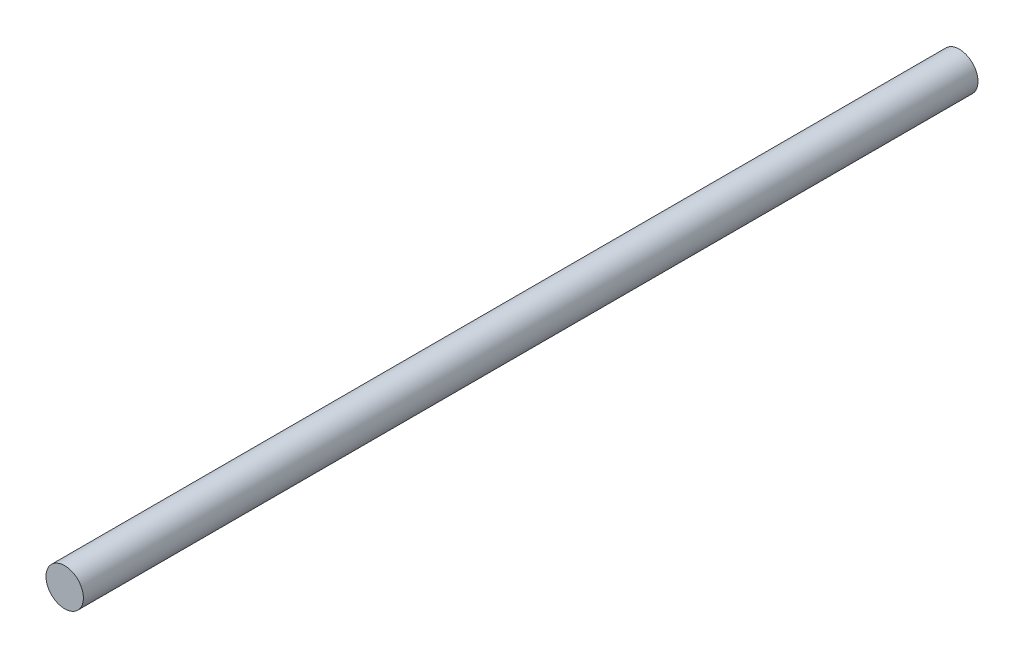
ISO-10303-21;
HEADER;
FILE_DESCRIPTION(('STEP AP214'),'2;1');
FILE_NAME('part.step','',(''),(''),'','','');
FILE_SCHEMA(('AUTOMOTIVE_DESIGN { 1 0 10303 214 1 1 1 1 }'));
ENDSEC;
DATA;
#1=APPLICATION_CONTEXT('core data for automotive mechanical design processes');
#2=APPLICATION_PROTOCOL_DEFINITION('international standard','automotive_design',2000,#1);
#3=PRODUCT_CONTEXT('',#1,'mechanical');
#4=PRODUCT('Part','Part','',(#3));
#5=PRODUCT_RELATED_PRODUCT_CATEGORY('part','',(#4));
#6=PRODUCT_DEFINITION_FORMATION('','',#4);
#7=PRODUCT_DEFINITION_CONTEXT('part definition',#1,'design');
#8=PRODUCT_DEFINITION('design','',#6,#7);
#9=PRODUCT_DEFINITION_SHAPE('','',#8);
#10=(LENGTH_UNIT() NAMED_UNIT(*) SI_UNIT(.MILLI.,.METRE.));
#11=(NAMED_UNIT(*) PLANE_ANGLE_UNIT() SI_UNIT($,.RADIAN.));
#12=(NAMED_UNIT(*) SI_UNIT($,.STERADIAN.) SOLID_ANGLE_UNIT());
#13=UNCERTAINTY_MEASURE_WITH_UNIT(LENGTH_MEASURE(1.E-05),#10,'distance_accuracy_value','');
#14=(GEOMETRIC_REPRESENTATION_CONTEXT(3) GLOBAL_UNCERTAINTY_ASSIGNED_CONTEXT((#13)) GLOBAL_UNIT_ASSIGNED_CONTEXT((#10,
#11,#12)) REPRESENTATION_CONTEXT('',''));
#15=CARTESIAN_POINT('',(0.,0.,0.));
#16=DIRECTION('',(0.,0.,1.));
#17=DIRECTION('',(1.,0.,0.));
#18=AXIS2_PLACEMENT_3D('',#15,#16,#17);
#19=CARTESIAN_POINT('',(0.,0.,-303.53));
#20=DIRECTION('',(0.,0.,1.));
#21=DIRECTION('',(1.,0.,0.));
#22=AXIS2_PLACEMENT_3D('',#19,#20,#21);
#23=CYLINDRICAL_SURFACE('',#22,6.35);
#24=CARTESIAN_POINT('',(0.,0.,-303.53));
#25=DIRECTION('',(0.,0.,1.));
#26=DIRECTION('',(1.,0.,0.));
#27=AXIS2_PLACEMENT_3D('',#24,#25,#26);
#28=CIRCLE('',#27,6.35);
#29=CARTESIAN_POINT('',(6.35,0.,-303.53));
#30=VERTEX_POINT('',#29);
#31=EDGE_CURVE('E10',#30,#30,#28,.T.);
#32=CARTESIAN_POINT('',(0.,0.,0.));
#33=DIRECTION('',(0.,0.,1.));
#34=DIRECTION('',(1.,0.,0.));
#35=AXIS2_PLACEMENT_3D('',#32,#33,#34);
#36=CIRCLE('',#35,6.35);
#37=CARTESIAN_POINT('',(6.35,0.,0.));
#38=VERTEX_POINT('',#37);
#39=EDGE_CURVE('E40',#38,#38,#36,.T.);
#40=CARTESIAN_POINT('',(6.35,0.,-303.53));
#41=CARTESIAN_POINT('',(6.35,0.,-300.368229166667));
#42=CARTESIAN_POINT('',(6.35,0.,-297.206458333333));
#43=CARTESIAN_POINT('',(6.35,0.,-290.882916666667));
#44=CARTESIAN_POINT('',(6.35,0.,-287.721145833333));
#45=CARTESIAN_POINT('',(6.35,0.,-281.397604166667));
#46=CARTESIAN_POINT('',(6.35,0.,-278.235833333333));
#47=CARTESIAN_POINT('',(6.35,0.,-271.912291666667));
#48=CARTESIAN_POINT('',(6.35,0.,-268.750520833333));
#49=CARTESIAN_POINT('',(6.35,0.,-262.426979166667));
#50=CARTESIAN_POINT('',(6.35,0.,-259.265208333333));
#51=CARTESIAN_POINT('',(6.35,0.,-252.941666666667));
#52=CARTESIAN_POINT('',(6.35,0.,-249.779895833333));
#53=CARTESIAN_POINT('',(6.35,0.,-243.456354166667));
#54=CARTESIAN_POINT('',(6.35,0.,-240.294583333333));
#55=CARTESIAN_POINT('',(6.35,0.,-233.971041666667));
#56=CARTESIAN_POINT('',(6.35,0.,-230.809270833333));
#57=CARTESIAN_POINT('',(6.35,0.,-224.485729166667));
#58=CARTESIAN_POINT('',(6.35,0.,-221.323958333333));
#59=CARTESIAN_POINT('',(6.35,0.,-215.000416666667));
#60=CARTESIAN_POINT('',(6.35,0.,-211.838645833333));
#61=CARTESIAN_POINT('',(6.35,0.,-205.515104166667));
#62=CARTESIAN_POINT('',(6.35,0.,-202.353333333333));
#63=CARTESIAN_POINT('',(6.35,0.,-196.029791666667));
#64=CARTESIAN_POINT('',(6.35,0.,-192.868020833333));
#65=CARTESIAN_POINT('',(6.35,0.,-186.544479166667));
#66=CARTESIAN_POINT('',(6.35,0.,-183.382708333333));
#67=CARTESIAN_POINT('',(6.35,0.,-177.059166666667));
#68=CARTESIAN_POINT('',(6.35,0.,-173.897395833333));
#69=CARTESIAN_POINT('',(6.35,0.,-167.573854166667));
#70=CARTESIAN_POINT('',(6.35,0.,-164.412083333333));
#71=CARTESIAN_POINT('',(6.35,0.,-158.088541666667));
#72=CARTESIAN_POINT('',(6.35,0.,-154.926770833333));
#73=CARTESIAN_POINT('',(6.35,0.,-148.603229166667));
#74=CARTESIAN_POINT('',(6.35,0.,-145.441458333333));
#75=CARTESIAN_POINT('',(6.35,0.,-139.117916666667));
#76=CARTESIAN_POINT('',(6.35,0.,-135.956145833333));
#77=CARTESIAN_POINT('',(6.35,0.,-129.632604166667));
#78=CARTESIAN_POINT('',(6.35,0.,-126.470833333333));
#79=CARTESIAN_POINT('',(6.35,0.,-120.147291666667));
#80=CARTESIAN_POINT('',(6.35,0.,-116.985520833333));
#81=CARTESIAN_POINT('',(6.35,0.,-110.661979166667));
#82=CARTESIAN_POINT('',(6.35,0.,-107.500208333333));
#83=CARTESIAN_POINT('',(6.35,0.,-101.176666666667));
#84=CARTESIAN_POINT('',(6.35,0.,-98.0148958333334));
#85=CARTESIAN_POINT('',(6.35,0.,-91.6913541666667));
#86=CARTESIAN_POINT('',(6.35,0.,-88.5295833333333));
#87=CARTESIAN_POINT('',(6.35,0.,-82.2060416666667));
#88=CARTESIAN_POINT('',(6.35,0.,-79.0442708333333));
#89=CARTESIAN_POINT('',(6.35,0.,-72.7207291666667));
#90=CARTESIAN_POINT('',(6.35,0.,-69.5589583333334));
#91=CARTESIAN_POINT('',(6.35,0.,-63.2354166666667));
#92=CARTESIAN_POINT('',(6.35,0.,-60.0736458333333));
#93=CARTESIAN_POINT('',(6.35,0.,-53.7501041666667));
#94=CARTESIAN_POINT('',(6.35,0.,-50.5883333333334));
#95=CARTESIAN_POINT('',(6.35,0.,-44.2647916666667));
#96=CARTESIAN_POINT('',(6.35,0.,-41.1030208333334));
#97=CARTESIAN_POINT('',(6.35,0.,-34.7794791666667));
#98=CARTESIAN_POINT('',(6.35,0.,-31.6177083333334));
#99=CARTESIAN_POINT('',(6.35,0.,-25.2941666666667));
#100=CARTESIAN_POINT('',(6.35,0.,-22.1323958333334));
#101=CARTESIAN_POINT('',(6.35,0.,-15.8088541666667));
#102=CARTESIAN_POINT('',(6.35,0.,-12.6470833333334));
#103=CARTESIAN_POINT('',(6.35,0.,-6.32354166666673));
#104=CARTESIAN_POINT('',(6.35,0.,-3.16177083333339));
#105=CARTESIAN_POINT('',(6.35,0.,0.));
#106=B_SPLINE_CURVE_WITH_KNOTS('',3,(#40,#41,#42,#43,#44,#45,#46,#47,#48,#49,#50,#51,#52,#53,
#54,#55,#56,#57,#58,#59,#60,#61,#62,#63,#64,#65,#66,#67,#68,#69,#70,#71,#72,#73,#74,#75,#76,#77,
#78,#79,#80,#81,#82,#83,#84,#85,#86,#87,#88,#89,#90,#91,#92,#93,#94,#95,#96,#97,#98,#99,#100,
#101,#102,#103,#104,#105),.UNSPECIFIED.,.F.,.F.,(4,2,2,2,2,2,2,2,2,2,2,2,2,2,2,2,2,2,2,2,2,2,2,
2,2,2,2,2,2,2,2,2,4),(0.,9.48531250000001,18.970625,28.4559375,37.94125,47.4265625,56.911875,
66.3971875,75.8825,85.3678125,94.853125,104.3384375,113.82375,123.3090625,132.794375,
142.2796875,151.765,161.2503125,170.735625,180.2209375,189.70625,199.1915625,208.676875,
218.1621875,227.6475,237.1328125,246.618125,256.1034375,265.58875,275.0740625,284.559375,
294.0446875,303.53),.UNSPECIFIED.);
#107=EDGE_CURVE('BSEAM37',#30,#38,#106,.T.);
#108=ORIENTED_EDGE('',*,*,#31,.T.);
#109=ORIENTED_EDGE('',*,*,#39,.F.);
#110=ORIENTED_EDGE('',*,*,#107,.T.);
#111=ORIENTED_EDGE('',*,*,#107,.F.);
#112=EDGE_LOOP('',(#108,#110,#109,#111));
#113=FACE_BOUND('',#112,.T.);
#114=ADVANCED_FACE('F37',(#113),#23,.T.);
#115=CARTESIAN_POINT('',(0.,0.,-303.53));
#116=DIRECTION('',(0.,0.,1.));
#117=DIRECTION('',(1.,0.,0.));
#118=AXIS2_PLACEMENT_3D('',#115,#116,#117);
#119=PLANE('',#118);
#120=ORIENTED_EDGE('',*,*,#31,.F.);
#121=EDGE_LOOP('',(#120));
#122=FACE_BOUND('',#121,.T.);
#123=ADVANCED_FACE('F54',(#122),#119,.F.);
#124=CARTESIAN_POINT('',(0.,0.,0.));
#125=DIRECTION('',(0.,0.,1.));
#126=DIRECTION('',(1.,0.,0.));
#127=AXIS2_PLACEMENT_3D('',#124,#125,#126);
#128=PLANE('',#127);
#129=ORIENTED_EDGE('',*,*,#39,.T.);
#130=EDGE_LOOP('',(#129));
#131=FACE_BOUND('',#130,.T.);
#132=ADVANCED_FACE('F51',(#131),#128,.T.);
#133=CLOSED_SHELL('',(#114,#123,#132));
#134=MANIFOLD_SOLID_BREP('B2',#133);
#135=ADVANCED_BREP_SHAPE_REPRESENTATION('',(#18,#134),#14);
#136=SHAPE_DEFINITION_REPRESENTATION(#9,#135);
ENDSEC;
END-ISO-10303-21;
